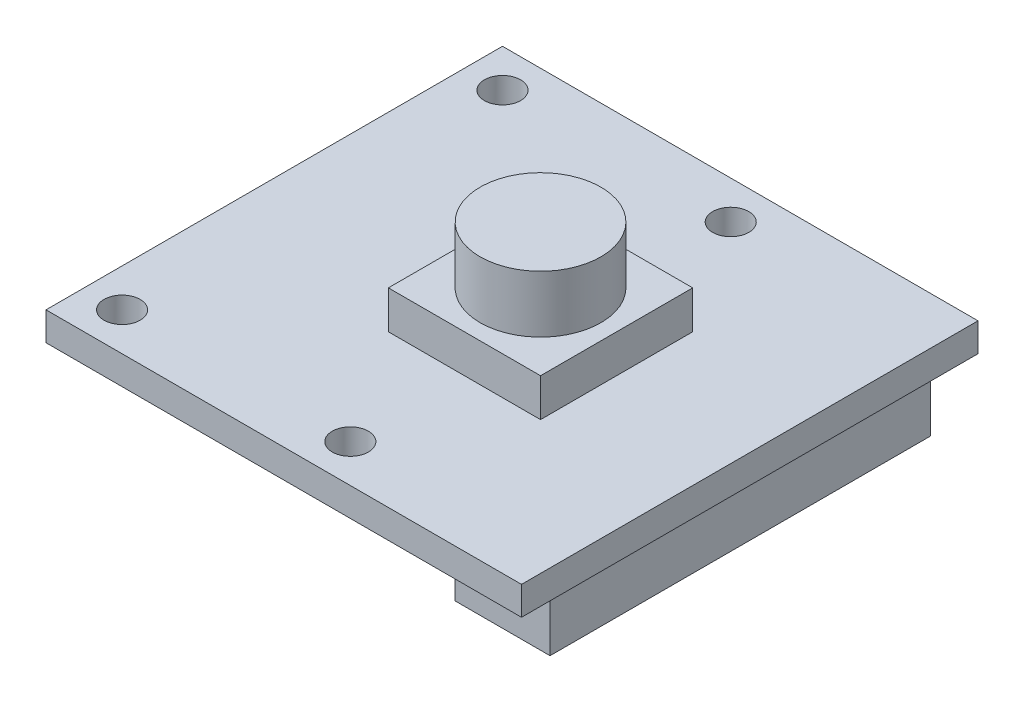
ISO-10303-21;
HEADER;
FILE_DESCRIPTION(('STEP AP214'),'2;1');
FILE_NAME('part.step','',(''),(''),'','','');
FILE_SCHEMA(('AUTOMOTIVE_DESIGN { 1 0 10303 214 1 1 1 1 }'));
ENDSEC;
DATA;
#1=APPLICATION_CONTEXT('core data for automotive mechanical design processes');
#2=APPLICATION_PROTOCOL_DEFINITION('international standard','automotive_design',2000,#1);
#3=PRODUCT_CONTEXT('',#1,'mechanical');
#4=PRODUCT('Part','Part','',(#3));
#5=PRODUCT_RELATED_PRODUCT_CATEGORY('part','',(#4));
#6=PRODUCT_DEFINITION_FORMATION('','',#4);
#7=PRODUCT_DEFINITION_CONTEXT('part definition',#1,'design');
#8=PRODUCT_DEFINITION('design','',#6,#7);
#9=PRODUCT_DEFINITION_SHAPE('','',#8);
#10=(LENGTH_UNIT() NAMED_UNIT(*) SI_UNIT(.MILLI.,.METRE.));
#11=(NAMED_UNIT(*) PLANE_ANGLE_UNIT() SI_UNIT($,.RADIAN.));
#12=(NAMED_UNIT(*) SI_UNIT($,.STERADIAN.) SOLID_ANGLE_UNIT());
#13=UNCERTAINTY_MEASURE_WITH_UNIT(LENGTH_MEASURE(1.E-05),#10,'distance_accuracy_value','');
#14=(GEOMETRIC_REPRESENTATION_CONTEXT(3) GLOBAL_UNCERTAINTY_ASSIGNED_CONTEXT((#13)) GLOBAL_UNIT_ASSIGNED_CONTEXT((#10,
#11,#12)) REPRESENTATION_CONTEXT('',''));
#15=CARTESIAN_POINT('',(0.,0.,0.));
#16=DIRECTION('',(0.,0.,1.));
#17=DIRECTION('',(1.,0.,0.));
#18=AXIS2_PLACEMENT_3D('',#15,#16,#17);
#19=CARTESIAN_POINT('',(0.,0.,0.));
#20=DIRECTION('',(0.,-1.,0.));
#21=DIRECTION('',(0.,0.,-1.));
#22=AXIS2_PLACEMENT_3D('',#19,#20,#21);
#23=PLANE('',#22);
#24=CARTESIAN_POINT('',(1.5,0.,-10.));
#25=DIRECTION('',(0.,-1.,0.));
#26=DIRECTION('',(0.,0.,-1.));
#27=AXIS2_PLACEMENT_3D('',#24,#25,#26);
#28=CIRCLE('',#27,0.95);
#29=CARTESIAN_POINT('',(1.5,0.,-10.95));
#30=VERTEX_POINT('',#29);
#31=EDGE_CURVE('E428',#30,#30,#28,.F.);
#32=ORIENTED_EDGE('',*,*,#31,.T.);
#33=EDGE_LOOP('',(#32));
#34=FACE_BOUND('',#33,.T.);
#35=CARTESIAN_POINT('',(-10.5,0.,10.));
#36=DIRECTION('',(0.,-1.,0.));
#37=DIRECTION('',(0.,0.,-1.));
#38=AXIS2_PLACEMENT_3D('',#35,#36,#37);
#39=CIRCLE('',#38,0.949999999999999);
#40=CARTESIAN_POINT('',(-10.5,0.,9.05));
#41=VERTEX_POINT('',#40);
#42=EDGE_CURVE('E431',#41,#41,#39,.F.);
#43=ORIENTED_EDGE('',*,*,#42,.T.);
#44=EDGE_LOOP('',(#43));
#45=FACE_BOUND('',#44,.T.);
#46=CARTESIAN_POINT('',(1.5,0.,10.));
#47=DIRECTION('',(0.,-1.,0.));
#48=DIRECTION('',(0.,0.,-1.));
#49=AXIS2_PLACEMENT_3D('',#46,#47,#48);
#50=CIRCLE('',#49,0.95);
#51=CARTESIAN_POINT('',(1.5,0.,9.05));
#52=VERTEX_POINT('',#51);
#53=EDGE_CURVE('E445',#52,#52,#50,.F.);
#54=ORIENTED_EDGE('',*,*,#53,.T.);
#55=EDGE_LOOP('',(#54));
#56=FACE_BOUND('',#55,.T.);
#57=CARTESIAN_POINT('',(-10.5,0.,-10.));
#58=DIRECTION('',(0.,-1.,0.));
#59=DIRECTION('',(0.,0.,-1.));
#60=AXIS2_PLACEMENT_3D('',#57,#58,#59);
#61=CIRCLE('',#60,0.949999999999999);
#62=CARTESIAN_POINT('',(-10.5,0.,-10.95));
#63=VERTEX_POINT('',#62);
#64=EDGE_CURVE('E433',#63,#63,#61,.F.);
#65=ORIENTED_EDGE('',*,*,#64,.T.);
#66=EDGE_LOOP('',(#65));
#67=FACE_BOUND('',#66,.T.);
#68=DIRECTION('',(0.,0.,1.));
#69=VECTOR('',#68,1.);
#70=CARTESIAN_POINT('',(-12.5,0.,-12.));
#71=LINE('',#70,#69);
#72=CARTESIAN_POINT('',(-12.5,0.,-12.));
#73=VERTEX_POINT('',#72);
#74=CARTESIAN_POINT('',(-12.5,0.,12.));
#75=VERTEX_POINT('',#74);
#76=EDGE_CURVE('E193',#73,#75,#71,.T.);
#77=ORIENTED_EDGE('',*,*,#76,.F.);
#78=DIRECTION('',(-1.,0.,0.));
#79=VECTOR('',#78,1.);
#80=CARTESIAN_POINT('',(12.5,0.,-12.));
#81=LINE('',#80,#79);
#82=CARTESIAN_POINT('',(12.5,0.,-12.));
#83=VERTEX_POINT('',#82);
#84=EDGE_CURVE('E198',#83,#73,#81,.T.);
#85=ORIENTED_EDGE('',*,*,#84,.F.);
#86=DIRECTION('',(0.,0.,-1.));
#87=VECTOR('',#86,1.);
#88=CARTESIAN_POINT('',(12.5,0.,-12.));
#89=LINE('',#88,#87);
#90=CARTESIAN_POINT('',(12.5,0.,12.));
#91=VERTEX_POINT('',#90);
#92=EDGE_CURVE('E210',#91,#83,#89,.T.);
#93=ORIENTED_EDGE('',*,*,#92,.F.);
#94=DIRECTION('',(1.,0.,0.));
#95=VECTOR('',#94,1.);
#96=CARTESIAN_POINT('',(12.5,0.,12.));
#97=LINE('',#96,#95);
#98=EDGE_CURVE('E202',#75,#91,#97,.T.);
#99=ORIENTED_EDGE('',*,*,#98,.F.);
#100=EDGE_LOOP('',(#77,#85,#93,#99));
#101=FACE_BOUND('',#100,.T.);
#102=DIRECTION('',(1.,0.,0.));
#103=VECTOR('',#102,1.);
#104=CARTESIAN_POINT('',(7.00000000000001,0.,-10.));
#105=LINE('',#104,#103);
#106=CARTESIAN_POINT('',(7.00000000000001,0.,-10.));
#107=VERTEX_POINT('',#106);
#108=CARTESIAN_POINT('',(12.,0.,-10.));
#109=VERTEX_POINT('',#108);
#110=EDGE_CURVE('E454',#107,#109,#105,.T.);
#111=ORIENTED_EDGE('',*,*,#110,.F.);
#112=DIRECTION('',(0.,0.,-1.));
#113=VECTOR('',#112,1.);
#114=CARTESIAN_POINT('',(7.00000000000001,0.,10.));
#115=LINE('',#114,#113);
#116=CARTESIAN_POINT('',(7.00000000000001,0.,10.));
#117=VERTEX_POINT('',#116);
#118=EDGE_CURVE('E155',#117,#107,#115,.T.);
#119=ORIENTED_EDGE('',*,*,#118,.F.);
#120=DIRECTION('',(-1.,0.,0.));
#121=VECTOR('',#120,1.);
#122=CARTESIAN_POINT('',(7.00000000000001,0.,10.));
#123=LINE('',#122,#121);
#124=CARTESIAN_POINT('',(12.,0.,10.));
#125=VERTEX_POINT('',#124);
#126=EDGE_CURVE('E146',#125,#117,#123,.T.);
#127=ORIENTED_EDGE('',*,*,#126,.F.);
#128=DIRECTION('',(0.,0.,1.));
#129=VECTOR('',#128,1.);
#130=CARTESIAN_POINT('',(12.,0.,10.));
#131=LINE('',#130,#129);
#132=EDGE_CURVE('E455',#109,#125,#131,.T.);
#133=ORIENTED_EDGE('',*,*,#132,.F.);
#134=EDGE_LOOP('',(#111,#119,#127,#133));
#135=FACE_BOUND('',#134,.T.);
#136=ADVANCED_FACE('F39',(#34,#45,#56,#67,#101,#135),#23,.T.);
#137=CARTESIAN_POINT('',(0.,1.5,0.));
#138=DIRECTION('',(0.,-1.,0.));
#139=DIRECTION('',(0.,0.,-1.));
#140=AXIS2_PLACEMENT_3D('',#137,#138,#139);
#141=PLANE('',#140);
#142=CARTESIAN_POINT('',(1.5,1.5,-10.));
#143=DIRECTION('',(0.,1.,0.));
#144=DIRECTION('',(0.,0.,1.));
#145=AXIS2_PLACEMENT_3D('',#142,#143,#144);
#146=CIRCLE('',#145,0.95);
#147=CARTESIAN_POINT('',(1.5,1.5,-9.05));
#148=VERTEX_POINT('',#147);
#149=EDGE_CURVE('E429',#148,#148,#146,.T.);
#150=ORIENTED_EDGE('',*,*,#149,.F.);
#151=EDGE_LOOP('',(#150));
#152=FACE_BOUND('',#151,.T.);
#153=CARTESIAN_POINT('',(-10.5,1.5,10.));
#154=DIRECTION('',(0.,1.,0.));
#155=DIRECTION('',(0.,0.,1.));
#156=AXIS2_PLACEMENT_3D('',#153,#154,#155);
#157=CIRCLE('',#156,0.949999999999999);
#158=CARTESIAN_POINT('',(-10.5,1.5,10.95));
#159=VERTEX_POINT('',#158);
#160=EDGE_CURVE('E436',#159,#159,#157,.T.);
#161=ORIENTED_EDGE('',*,*,#160,.F.);
#162=EDGE_LOOP('',(#161));
#163=FACE_BOUND('',#162,.T.);
#164=CARTESIAN_POINT('',(1.5,1.5,10.));
#165=DIRECTION('',(0.,1.,0.));
#166=DIRECTION('',(0.,0.,1.));
#167=AXIS2_PLACEMENT_3D('',#164,#165,#166);
#168=CIRCLE('',#167,0.95);
#169=CARTESIAN_POINT('',(1.5,1.5,10.95));
#170=VERTEX_POINT('',#169);
#171=EDGE_CURVE('E469',#170,#170,#168,.T.);
#172=ORIENTED_EDGE('',*,*,#171,.F.);
#173=EDGE_LOOP('',(#172));
#174=FACE_BOUND('',#173,.T.);
#175=CARTESIAN_POINT('',(-10.5,1.5,-10.));
#176=DIRECTION('',(0.,1.,0.));
#177=DIRECTION('',(0.,0.,1.));
#178=AXIS2_PLACEMENT_3D('',#175,#176,#177);
#179=CIRCLE('',#178,0.949999999999999);
#180=CARTESIAN_POINT('',(-10.5,1.5,-9.05));
#181=VERTEX_POINT('',#180);
#182=EDGE_CURVE('E444',#181,#181,#179,.T.);
#183=ORIENTED_EDGE('',*,*,#182,.F.);
#184=EDGE_LOOP('',(#183));
#185=FACE_BOUND('',#184,.T.);
#186=DIRECTION('',(0.,0.,1.));
#187=VECTOR('',#186,1.);
#188=CARTESIAN_POINT('',(-12.5,1.5,-12.));
#189=LINE('',#188,#187);
#190=CARTESIAN_POINT('',(-12.5,1.5,-12.));
#191=VERTEX_POINT('',#190);
#192=CARTESIAN_POINT('',(-12.5,1.5,12.));
#193=VERTEX_POINT('',#192);
#194=EDGE_CURVE('E194',#191,#193,#189,.T.);
#195=ORIENTED_EDGE('',*,*,#194,.T.);
#196=DIRECTION('',(1.,0.,0.));
#197=VECTOR('',#196,1.);
#198=CARTESIAN_POINT('',(12.5,1.5,12.));
#199=LINE('',#198,#197);
#200=CARTESIAN_POINT('',(12.5,1.5,12.));
#201=VERTEX_POINT('',#200);
#202=EDGE_CURVE('E191',#193,#201,#199,.T.);
#203=ORIENTED_EDGE('',*,*,#202,.T.);
#204=DIRECTION('',(0.,0.,-1.));
#205=VECTOR('',#204,1.);
#206=CARTESIAN_POINT('',(12.5,1.5,-12.));
#207=LINE('',#206,#205);
#208=CARTESIAN_POINT('',(12.5,1.5,-12.));
#209=VERTEX_POINT('',#208);
#210=EDGE_CURVE('E196',#201,#209,#207,.T.);
#211=ORIENTED_EDGE('',*,*,#210,.T.);
#212=DIRECTION('',(-1.,0.,0.));
#213=VECTOR('',#212,1.);
#214=CARTESIAN_POINT('',(12.5,1.5,-12.));
#215=LINE('',#214,#213);
#216=EDGE_CURVE('E199',#209,#191,#215,.T.);
#217=ORIENTED_EDGE('',*,*,#216,.T.);
#218=EDGE_LOOP('',(#195,#203,#211,#217));
#219=FACE_BOUND('',#218,.T.);
#220=DIRECTION('',(0.,0.,-1.));
#221=VECTOR('',#220,1.);
#222=CARTESIAN_POINT('',(5.5,1.5,4.));
#223=LINE('',#222,#221);
#224=CARTESIAN_POINT('',(5.5,1.5,4.));
#225=VERTEX_POINT('',#224);
#226=CARTESIAN_POINT('',(5.5,1.5,-4.));
#227=VERTEX_POINT('',#226);
#228=EDGE_CURVE('E65',#225,#227,#223,.T.);
#229=ORIENTED_EDGE('',*,*,#228,.F.);
#230=DIRECTION('',(1.,0.,0.));
#231=VECTOR('',#230,1.);
#232=CARTESIAN_POINT('',(-2.5,1.5,4.));
#233=LINE('',#232,#231);
#234=CARTESIAN_POINT('',(-2.5,1.5,4.));
#235=VERTEX_POINT('',#234);
#236=EDGE_CURVE('E164',#235,#225,#233,.T.);
#237=ORIENTED_EDGE('',*,*,#236,.F.);
#238=DIRECTION('',(0.,0.,1.));
#239=VECTOR('',#238,1.);
#240=CARTESIAN_POINT('',(-2.5,1.5,4.));
#241=LINE('',#240,#239);
#242=CARTESIAN_POINT('',(-2.5,1.5,-4.));
#243=VERTEX_POINT('',#242);
#244=EDGE_CURVE('E178',#243,#235,#241,.T.);
#245=ORIENTED_EDGE('',*,*,#244,.F.);
#246=DIRECTION('',(-1.,0.,0.));
#247=VECTOR('',#246,1.);
#248=CARTESIAN_POINT('',(-2.5,1.5,-4.));
#249=LINE('',#248,#247);
#250=EDGE_CURVE('E175',#227,#243,#249,.T.);
#251=ORIENTED_EDGE('',*,*,#250,.F.);
#252=EDGE_LOOP('',(#229,#237,#245,#251));
#253=FACE_BOUND('',#252,.T.);
#254=ADVANCED_FACE('F240',(#152,#163,#174,#185,#219,#253),#141,.F.);
#255=CARTESIAN_POINT('',(-12.5,1.5,-12.));
#256=DIRECTION('',(1.,0.,0.));
#257=DIRECTION('',(0.,0.,-1.));
#258=AXIS2_PLACEMENT_3D('',#255,#256,#257);
#259=PLANE('',#258);
#260=ORIENTED_EDGE('',*,*,#76,.T.);
#261=DIRECTION('',(0.,-1.,0.));
#262=VECTOR('',#261,1.);
#263=CARTESIAN_POINT('',(-12.5,1.5,12.));
#264=LINE('',#263,#262);
#265=EDGE_CURVE('E43',#193,#75,#264,.T.);
#266=ORIENTED_EDGE('',*,*,#265,.F.);
#267=ORIENTED_EDGE('',*,*,#194,.F.);
#268=DIRECTION('',(0.,-1.,0.));
#269=VECTOR('',#268,1.);
#270=CARTESIAN_POINT('',(-12.5,1.5,-12.));
#271=LINE('',#270,#269);
#272=EDGE_CURVE('E205',#191,#73,#271,.T.);
#273=ORIENTED_EDGE('',*,*,#272,.T.);
#274=EDGE_LOOP('',(#260,#266,#267,#273));
#275=FACE_BOUND('',#274,.T.);
#276=ADVANCED_FACE('F41',(#275),#259,.F.);
#277=CARTESIAN_POINT('',(12.5,1.5,12.));
#278=DIRECTION('',(0.,0.,-1.));
#279=DIRECTION('',(-1.,0.,0.));
#280=AXIS2_PLACEMENT_3D('',#277,#278,#279);
#281=PLANE('',#280);
#282=ORIENTED_EDGE('',*,*,#98,.T.);
#283=DIRECTION('',(0.,-1.,0.));
#284=VECTOR('',#283,1.);
#285=CARTESIAN_POINT('',(12.5,1.5,12.));
#286=LINE('',#285,#284);
#287=EDGE_CURVE('E212',#201,#91,#286,.T.);
#288=ORIENTED_EDGE('',*,*,#287,.F.);
#289=ORIENTED_EDGE('',*,*,#202,.F.);
#290=ORIENTED_EDGE('',*,*,#265,.T.);
#291=EDGE_LOOP('',(#282,#288,#289,#290));
#292=FACE_BOUND('',#291,.T.);
#293=ADVANCED_FACE('F224',(#292),#281,.F.);
#294=CARTESIAN_POINT('',(12.5,1.5,-12.));
#295=DIRECTION('',(-1.,0.,0.));
#296=DIRECTION('',(0.,0.,1.));
#297=AXIS2_PLACEMENT_3D('',#294,#295,#296);
#298=PLANE('',#297);
#299=ORIENTED_EDGE('',*,*,#92,.T.);
#300=DIRECTION('',(0.,-1.,0.));
#301=VECTOR('',#300,1.);
#302=CARTESIAN_POINT('',(12.5,1.5,-12.));
#303=LINE('',#302,#301);
#304=EDGE_CURVE('E215',#209,#83,#303,.T.);
#305=ORIENTED_EDGE('',*,*,#304,.F.);
#306=ORIENTED_EDGE('',*,*,#210,.F.);
#307=ORIENTED_EDGE('',*,*,#287,.T.);
#308=EDGE_LOOP('',(#299,#305,#306,#307));
#309=FACE_BOUND('',#308,.T.);
#310=ADVANCED_FACE('F234',(#309),#298,.F.);
#311=CARTESIAN_POINT('',(12.5,1.5,-12.));
#312=DIRECTION('',(0.,0.,1.));
#313=DIRECTION('',(1.,0.,0.));
#314=AXIS2_PLACEMENT_3D('',#311,#312,#313);
#315=PLANE('',#314);
#316=ORIENTED_EDGE('',*,*,#84,.T.);
#317=ORIENTED_EDGE('',*,*,#272,.F.);
#318=ORIENTED_EDGE('',*,*,#216,.F.);
#319=ORIENTED_EDGE('',*,*,#304,.T.);
#320=EDGE_LOOP('',(#316,#317,#318,#319));
#321=FACE_BOUND('',#320,.T.);
#322=ADVANCED_FACE('F231',(#321),#315,.F.);
#323=CARTESIAN_POINT('',(5.5,3.5,4.));
#324=DIRECTION('',(-1.,0.,0.));
#325=DIRECTION('',(0.,0.,1.));
#326=AXIS2_PLACEMENT_3D('',#323,#324,#325);
#327=PLANE('',#326);
#328=ORIENTED_EDGE('',*,*,#228,.T.);
#329=DIRECTION('',(0.,-1.,0.));
#330=VECTOR('',#329,1.);
#331=CARTESIAN_POINT('',(5.5,3.5,-4.));
#332=LINE('',#331,#330);
#333=CARTESIAN_POINT('',(5.5,3.5,-4.));
#334=VERTEX_POINT('',#333);
#335=EDGE_CURVE('E190',#334,#227,#332,.T.);
#336=ORIENTED_EDGE('',*,*,#335,.F.);
#337=DIRECTION('',(0.,0.,-1.));
#338=VECTOR('',#337,1.);
#339=CARTESIAN_POINT('',(5.5,3.5,4.));
#340=LINE('',#339,#338);
#341=CARTESIAN_POINT('',(5.5,3.5,4.));
#342=VERTEX_POINT('',#341);
#343=EDGE_CURVE('E161',#342,#334,#340,.T.);
#344=ORIENTED_EDGE('',*,*,#343,.F.);
#345=DIRECTION('',(0.,-1.,0.));
#346=VECTOR('',#345,1.);
#347=CARTESIAN_POINT('',(5.5,3.5,4.));
#348=LINE('',#347,#346);
#349=EDGE_CURVE('E174',#342,#225,#348,.T.);
#350=ORIENTED_EDGE('',*,*,#349,.T.);
#351=EDGE_LOOP('',(#328,#336,#344,#350));
#352=FACE_BOUND('',#351,.T.);
#353=ADVANCED_FACE('F253',(#352),#327,.F.);
#354=CARTESIAN_POINT('',(-2.5,3.5,-4.));
#355=DIRECTION('',(0.,0.,1.));
#356=DIRECTION('',(1.,0.,0.));
#357=AXIS2_PLACEMENT_3D('',#354,#355,#356);
#358=PLANE('',#357);
#359=ORIENTED_EDGE('',*,*,#250,.T.);
#360=DIRECTION('',(0.,-1.,0.));
#361=VECTOR('',#360,1.);
#362=CARTESIAN_POINT('',(-2.5,3.5,-4.));
#363=LINE('',#362,#361);
#364=CARTESIAN_POINT('',(-2.5,3.5,-4.));
#365=VERTEX_POINT('',#364);
#366=EDGE_CURVE('E183',#365,#243,#363,.T.);
#367=ORIENTED_EDGE('',*,*,#366,.F.);
#368=DIRECTION('',(-1.,0.,0.));
#369=VECTOR('',#368,1.);
#370=CARTESIAN_POINT('',(-2.5,3.5,-4.));
#371=LINE('',#370,#369);
#372=EDGE_CURVE('E163',#334,#365,#371,.T.);
#373=ORIENTED_EDGE('',*,*,#372,.F.);
#374=ORIENTED_EDGE('',*,*,#335,.T.);
#375=EDGE_LOOP('',(#359,#367,#373,#374));
#376=FACE_BOUND('',#375,.T.);
#377=ADVANCED_FACE('F278',(#376),#358,.F.);
#378=CARTESIAN_POINT('',(-2.5,3.5,4.));
#379=DIRECTION('',(1.,0.,0.));
#380=DIRECTION('',(0.,0.,-1.));
#381=AXIS2_PLACEMENT_3D('',#378,#379,#380);
#382=PLANE('',#381);
#383=ORIENTED_EDGE('',*,*,#244,.T.);
#384=DIRECTION('',(0.,-1.,0.));
#385=VECTOR('',#384,1.);
#386=CARTESIAN_POINT('',(-2.5,3.5,4.));
#387=LINE('',#386,#385);
#388=CARTESIAN_POINT('',(-2.5,3.5,4.));
#389=VERTEX_POINT('',#388);
#390=EDGE_CURVE('E185',#389,#235,#387,.T.);
#391=ORIENTED_EDGE('',*,*,#390,.F.);
#392=DIRECTION('',(0.,0.,1.));
#393=VECTOR('',#392,1.);
#394=CARTESIAN_POINT('',(-2.5,3.5,4.));
#395=LINE('',#394,#393);
#396=EDGE_CURVE('E170',#365,#389,#395,.T.);
#397=ORIENTED_EDGE('',*,*,#396,.F.);
#398=ORIENTED_EDGE('',*,*,#366,.T.);
#399=EDGE_LOOP('',(#383,#391,#397,#398));
#400=FACE_BOUND('',#399,.T.);
#401=ADVANCED_FACE('F287',(#400),#382,.F.);
#402=CARTESIAN_POINT('',(-2.5,3.5,4.));
#403=DIRECTION('',(0.,0.,-1.));
#404=DIRECTION('',(-1.,0.,0.));
#405=AXIS2_PLACEMENT_3D('',#402,#403,#404);
#406=PLANE('',#405);
#407=ORIENTED_EDGE('',*,*,#236,.T.);
#408=ORIENTED_EDGE('',*,*,#349,.F.);
#409=DIRECTION('',(1.,0.,0.));
#410=VECTOR('',#409,1.);
#411=CARTESIAN_POINT('',(-2.5,3.5,4.));
#412=LINE('',#411,#410);
#413=EDGE_CURVE('E166',#389,#342,#412,.T.);
#414=ORIENTED_EDGE('',*,*,#413,.F.);
#415=ORIENTED_EDGE('',*,*,#390,.T.);
#416=EDGE_LOOP('',(#407,#408,#414,#415));
#417=FACE_BOUND('',#416,.T.);
#418=ADVANCED_FACE('F299',(#417),#406,.F.);
#419=CARTESIAN_POINT('',(0.,3.5,0.));
#420=DIRECTION('',(0.,-1.,0.));
#421=DIRECTION('',(0.,0.,-1.));
#422=AXIS2_PLACEMENT_3D('',#419,#420,#421);
#423=PLANE('',#422);
#424=CARTESIAN_POINT('',(1.5,3.5,0.));
#425=DIRECTION('',(0.,1.,0.));
#426=DIRECTION('',(0.,0.,1.));
#427=AXIS2_PLACEMENT_3D('',#424,#425,#426);
#428=CIRCLE('',#427,3.175);
#429=CARTESIAN_POINT('',(1.5,3.5,3.175));
#430=VERTEX_POINT('',#429);
#431=EDGE_CURVE('E11',#430,#430,#428,.T.);
#432=ORIENTED_EDGE('',*,*,#431,.F.);
#433=EDGE_LOOP('',(#432));
#434=FACE_BOUND('',#433,.T.);
#435=ORIENTED_EDGE('',*,*,#343,.T.);
#436=ORIENTED_EDGE('',*,*,#372,.T.);
#437=ORIENTED_EDGE('',*,*,#396,.T.);
#438=ORIENTED_EDGE('',*,*,#413,.T.);
#439=EDGE_LOOP('',(#435,#436,#437,#438));
#440=FACE_BOUND('',#439,.T.);
#441=ADVANCED_FACE('F301',(#434,#440),#423,.F.);
#442=CARTESIAN_POINT('',(1.5,6.5,0.));
#443=DIRECTION('',(0.,-1.,0.));
#444=DIRECTION('',(0.,0.,-1.));
#445=AXIS2_PLACEMENT_3D('',#442,#443,#444);
#446=CYLINDRICAL_SURFACE('',#445,3.175);
#447=CARTESIAN_POINT('',(1.5,6.5,0.));
#448=DIRECTION('',(0.,1.,0.));
#449=DIRECTION('',(0.,0.,1.));
#450=AXIS2_PLACEMENT_3D('',#447,#448,#449);
#451=CIRCLE('',#450,3.175);
#452=CARTESIAN_POINT('',(1.5,6.5,3.175));
#453=VERTEX_POINT('',#452);
#454=EDGE_CURVE('E152',#453,#453,#451,.T.);
#455=ORIENTED_EDGE('',*,*,#454,.F.);
#456=EDGE_LOOP('',(#455));
#457=FACE_BOUND('',#456,.T.);
#458=ORIENTED_EDGE('',*,*,#431,.T.);
#459=EDGE_LOOP('',(#458));
#460=FACE_BOUND('',#459,.T.);
#461=ADVANCED_FACE('F314',(#457,#460),#446,.T.);
#462=CARTESIAN_POINT('',(1.5,6.5,0.));
#463=DIRECTION('',(0.,1.,0.));
#464=DIRECTION('',(0.,0.,1.));
#465=AXIS2_PLACEMENT_3D('',#462,#463,#464);
#466=PLANE('',#465);
#467=ORIENTED_EDGE('',*,*,#454,.T.);
#468=EDGE_LOOP('',(#467));
#469=FACE_BOUND('',#468,.T.);
#470=ADVANCED_FACE('F323',(#469),#466,.T.);
#471=CARTESIAN_POINT('',(7.00000000000001,-3.,10.));
#472=DIRECTION('',(1.,0.,0.));
#473=DIRECTION('',(0.,0.,-1.));
#474=AXIS2_PLACEMENT_3D('',#471,#472,#473);
#475=PLANE('',#474);
#476=ORIENTED_EDGE('',*,*,#118,.T.);
#477=DIRECTION('',(0.,1.,0.));
#478=VECTOR('',#477,1.);
#479=CARTESIAN_POINT('',(7.00000000000001,-3.,-10.));
#480=LINE('',#479,#478);
#481=CARTESIAN_POINT('',(7.00000000000001,-3.,-10.));
#482=VERTEX_POINT('',#481);
#483=EDGE_CURVE('E135',#482,#107,#480,.T.);
#484=ORIENTED_EDGE('',*,*,#483,.F.);
#485=DIRECTION('',(0.,0.,-1.));
#486=VECTOR('',#485,1.);
#487=CARTESIAN_POINT('',(7.00000000000001,-3.,10.));
#488=LINE('',#487,#486);
#489=CARTESIAN_POINT('',(7.00000000000001,-3.,10.));
#490=VERTEX_POINT('',#489);
#491=EDGE_CURVE('E136',#490,#482,#488,.T.);
#492=ORIENTED_EDGE('',*,*,#491,.F.);
#493=DIRECTION('',(0.,1.,0.));
#494=VECTOR('',#493,1.);
#495=CARTESIAN_POINT('',(7.00000000000001,-3.,10.));
#496=LINE('',#495,#494);
#497=EDGE_CURVE('E447',#490,#117,#496,.T.);
#498=ORIENTED_EDGE('',*,*,#497,.T.);
#499=EDGE_LOOP('',(#476,#484,#492,#498));
#500=FACE_BOUND('',#499,.T.);
#501=ADVANCED_FACE('F147',(#500),#475,.F.);
#502=CARTESIAN_POINT('',(7.00000000000001,-3.,-10.));
#503=DIRECTION('',(0.,0.,1.));
#504=DIRECTION('',(1.,0.,0.));
#505=AXIS2_PLACEMENT_3D('',#502,#503,#504);
#506=PLANE('',#505);
#507=ORIENTED_EDGE('',*,*,#110,.T.);
#508=DIRECTION('',(0.,1.,0.));
#509=VECTOR('',#508,1.);
#510=CARTESIAN_POINT('',(12.,-3.,-10.));
#511=LINE('',#510,#509);
#512=CARTESIAN_POINT('',(12.,-3.,-10.));
#513=VERTEX_POINT('',#512);
#514=EDGE_CURVE('E138',#513,#109,#511,.T.);
#515=ORIENTED_EDGE('',*,*,#514,.F.);
#516=DIRECTION('',(1.,0.,0.));
#517=VECTOR('',#516,1.);
#518=CARTESIAN_POINT('',(7.00000000000001,-3.,-10.));
#519=LINE('',#518,#517);
#520=EDGE_CURVE('E129',#482,#513,#519,.T.);
#521=ORIENTED_EDGE('',*,*,#520,.F.);
#522=ORIENTED_EDGE('',*,*,#483,.T.);
#523=EDGE_LOOP('',(#507,#515,#521,#522));
#524=FACE_BOUND('',#523,.T.);
#525=ADVANCED_FACE('F134',(#524),#506,.F.);
#526=CARTESIAN_POINT('',(12.,-3.,10.));
#527=DIRECTION('',(-1.,0.,0.));
#528=DIRECTION('',(0.,0.,1.));
#529=AXIS2_PLACEMENT_3D('',#526,#527,#528);
#530=PLANE('',#529);
#531=ORIENTED_EDGE('',*,*,#132,.T.);
#532=DIRECTION('',(0.,1.,0.));
#533=VECTOR('',#532,1.);
#534=CARTESIAN_POINT('',(12.,-3.,10.));
#535=LINE('',#534,#533);
#536=CARTESIAN_POINT('',(12.,-3.,10.));
#537=VERTEX_POINT('',#536);
#538=EDGE_CURVE('E54',#537,#125,#535,.T.);
#539=ORIENTED_EDGE('',*,*,#538,.F.);
#540=DIRECTION('',(0.,0.,1.));
#541=VECTOR('',#540,1.);
#542=CARTESIAN_POINT('',(12.,-3.,10.));
#543=LINE('',#542,#541);
#544=EDGE_CURVE('E140',#513,#537,#543,.T.);
#545=ORIENTED_EDGE('',*,*,#544,.F.);
#546=ORIENTED_EDGE('',*,*,#514,.T.);
#547=EDGE_LOOP('',(#531,#539,#545,#546));
#548=FACE_BOUND('',#547,.T.);
#549=ADVANCED_FACE('F346',(#548),#530,.F.);
#550=CARTESIAN_POINT('',(7.00000000000001,-3.,10.));
#551=DIRECTION('',(0.,0.,-1.));
#552=DIRECTION('',(-1.,0.,0.));
#553=AXIS2_PLACEMENT_3D('',#550,#551,#552);
#554=PLANE('',#553);
#555=ORIENTED_EDGE('',*,*,#126,.T.);
#556=ORIENTED_EDGE('',*,*,#497,.F.);
#557=DIRECTION('',(-1.,0.,0.));
#558=VECTOR('',#557,1.);
#559=CARTESIAN_POINT('',(7.00000000000001,-3.,10.));
#560=LINE('',#559,#558);
#561=EDGE_CURVE('E145',#537,#490,#560,.T.);
#562=ORIENTED_EDGE('',*,*,#561,.F.);
#563=ORIENTED_EDGE('',*,*,#538,.T.);
#564=EDGE_LOOP('',(#555,#556,#562,#563));
#565=FACE_BOUND('',#564,.T.);
#566=ADVANCED_FACE('F358',(#565),#554,.F.);
#567=CARTESIAN_POINT('',(0.,-3.,0.));
#568=DIRECTION('',(0.,-1.,0.));
#569=DIRECTION('',(0.,0.,-1.));
#570=AXIS2_PLACEMENT_3D('',#567,#568,#569);
#571=PLANE('',#570);
#572=ORIENTED_EDGE('',*,*,#491,.T.);
#573=ORIENTED_EDGE('',*,*,#520,.T.);
#574=ORIENTED_EDGE('',*,*,#544,.T.);
#575=ORIENTED_EDGE('',*,*,#561,.T.);
#576=EDGE_LOOP('',(#572,#573,#574,#575));
#577=FACE_BOUND('',#576,.T.);
#578=ADVANCED_FACE('F141',(#577),#571,.T.);
#579=CARTESIAN_POINT('',(-10.5,-3.001,-10.));
#580=DIRECTION('',(0.,1.,0.));
#581=DIRECTION('',(0.,0.,1.));
#582=AXIS2_PLACEMENT_3D('',#579,#580,#581);
#583=CYLINDRICAL_SURFACE('',#582,0.949999999999999);
#584=ORIENTED_EDGE('',*,*,#64,.F.);
#585=EDGE_LOOP('',(#584));
#586=FACE_BOUND('',#585,.T.);
#587=ORIENTED_EDGE('',*,*,#182,.T.);
#588=EDGE_LOOP('',(#587));
#589=FACE_BOUND('',#588,.T.);
#590=ADVANCED_FACE('F371',(#586,#589),#583,.F.);
#591=CARTESIAN_POINT('',(1.5,-3.001,10.));
#592=DIRECTION('',(0.,1.,0.));
#593=DIRECTION('',(0.,0.,1.));
#594=AXIS2_PLACEMENT_3D('',#591,#592,#593);
#595=CYLINDRICAL_SURFACE('',#594,0.95);
#596=ORIENTED_EDGE('',*,*,#53,.F.);
#597=EDGE_LOOP('',(#596));
#598=FACE_BOUND('',#597,.T.);
#599=ORIENTED_EDGE('',*,*,#171,.T.);
#600=EDGE_LOOP('',(#599));
#601=FACE_BOUND('',#600,.T.);
#602=ADVANCED_FACE('F394',(#598,#601),#595,.F.);
#603=CARTESIAN_POINT('',(-10.5,-3.001,10.));
#604=DIRECTION('',(0.,1.,0.));
#605=DIRECTION('',(0.,0.,1.));
#606=AXIS2_PLACEMENT_3D('',#603,#604,#605);
#607=CYLINDRICAL_SURFACE('',#606,0.949999999999999);
#608=ORIENTED_EDGE('',*,*,#42,.F.);
#609=EDGE_LOOP('',(#608));
#610=FACE_BOUND('',#609,.T.);
#611=ORIENTED_EDGE('',*,*,#160,.T.);
#612=EDGE_LOOP('',(#611));
#613=FACE_BOUND('',#612,.T.);
#614=ADVANCED_FACE('F396',(#610,#613),#607,.F.);
#615=CARTESIAN_POINT('',(1.5,-3.001,-10.));
#616=DIRECTION('',(0.,1.,0.));
#617=DIRECTION('',(0.,0.,1.));
#618=AXIS2_PLACEMENT_3D('',#615,#616,#617);
#619=CYLINDRICAL_SURFACE('',#618,0.95);
#620=ORIENTED_EDGE('',*,*,#31,.F.);
#621=EDGE_LOOP('',(#620));
#622=FACE_BOUND('',#621,.T.);
#623=ORIENTED_EDGE('',*,*,#149,.T.);
#624=EDGE_LOOP('',(#623));
#625=FACE_BOUND('',#624,.T.);
#626=ADVANCED_FACE('F408',(#622,#625),#619,.F.);
#627=CLOSED_SHELL('',(#136,#254,#276,#293,#310,#322,#353,#377,#401,#418,#441,#461,#470,#501,
#525,#549,#566,#578,#590,#602,#614,#626));
#628=MANIFOLD_SOLID_BREP('B2',#627);
#629=ADVANCED_BREP_SHAPE_REPRESENTATION('',(#18,#628),#14);
#630=SHAPE_DEFINITION_REPRESENTATION(#9,#629);
ENDSEC;
END-ISO-10303-21;
